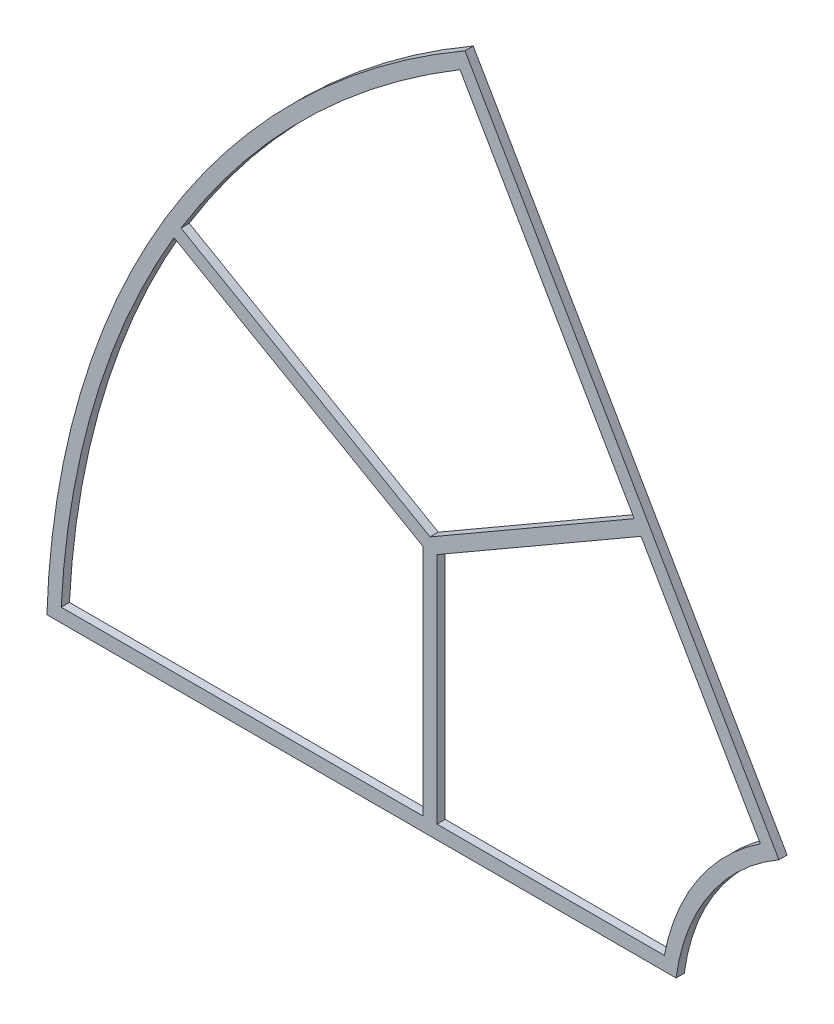
ISO-10303-21;
HEADER;
FILE_DESCRIPTION(('STEP AP214'),'2;1');
FILE_NAME('part.step','',(''),(''),'','','');
FILE_SCHEMA(('AUTOMOTIVE_DESIGN { 1 0 10303 214 1 1 1 1 }'));
ENDSEC;
DATA;
#1=APPLICATION_CONTEXT('core data for automotive mechanical design processes');
#2=APPLICATION_PROTOCOL_DEFINITION('international standard','automotive_design',2000,#1);
#3=PRODUCT_CONTEXT('',#1,'mechanical');
#4=PRODUCT('Part','Part','',(#3));
#5=PRODUCT_RELATED_PRODUCT_CATEGORY('part','',(#4));
#6=PRODUCT_DEFINITION_FORMATION('','',#4);
#7=PRODUCT_DEFINITION_CONTEXT('part definition',#1,'design');
#8=PRODUCT_DEFINITION('design','',#6,#7);
#9=PRODUCT_DEFINITION_SHAPE('','',#8);
#10=(LENGTH_UNIT() NAMED_UNIT(*) SI_UNIT(.MILLI.,.METRE.));
#11=(NAMED_UNIT(*) PLANE_ANGLE_UNIT() SI_UNIT($,.RADIAN.));
#12=(NAMED_UNIT(*) SI_UNIT($,.STERADIAN.) SOLID_ANGLE_UNIT());
#13=UNCERTAINTY_MEASURE_WITH_UNIT(LENGTH_MEASURE(1.E-05),#10,'distance_accuracy_value','');
#14=(GEOMETRIC_REPRESENTATION_CONTEXT(3) GLOBAL_UNCERTAINTY_ASSIGNED_CONTEXT((#13)) GLOBAL_UNIT_ASSIGNED_CONTEXT((#10,
#11,#12)) REPRESENTATION_CONTEXT('',''));
#15=CARTESIAN_POINT('',(0.,0.,0.));
#16=DIRECTION('',(0.,0.,1.));
#17=DIRECTION('',(1.,0.,0.));
#18=AXIS2_PLACEMENT_3D('',#15,#16,#17);
#19=CARTESIAN_POINT('',(0.,20.,6.));
#20=DIRECTION('',(0.,-1.,0.));
#21=DIRECTION('',(1.,0.,0.));
#22=AXIS2_PLACEMENT_3D('',#19,#20,#21);
#23=PLANE('',#22);
#24=DIRECTION('',(-1.,0.,0.));
#25=VECTOR('',#24,1.);
#26=CARTESIAN_POINT('',(0.,20.,0.));
#27=LINE('',#26,#25);
#28=CARTESIAN_POINT('',(-151.081964509335,20.,0.));
#29=VERTEX_POINT('',#28);
#30=CARTESIAN_POINT('',(-609.271827676268,20.,0.));
#31=VERTEX_POINT('',#30);
#32=EDGE_CURVE('E258',#29,#31,#27,.T.);
#33=ORIENTED_EDGE('',*,*,#32,.F.);
#34=DIRECTION('',(0.,0.,-1.));
#35=VECTOR('',#34,1.);
#36=CARTESIAN_POINT('',(-151.081964509335,20.,6.));
#37=LINE('',#36,#35);
#38=CARTESIAN_POINT('',(-151.081964509335,20.,6.));
#39=VERTEX_POINT('',#38);
#40=EDGE_CURVE('E11',#39,#29,#37,.T.);
#41=ORIENTED_EDGE('',*,*,#40,.F.);
#42=DIRECTION('',(-1.,0.,0.));
#43=VECTOR('',#42,1.);
#44=CARTESIAN_POINT('',(0.,20.,6.));
#45=LINE('',#44,#43);
#46=CARTESIAN_POINT('',(-609.271827676268,20.,6.));
#47=VERTEX_POINT('',#46);
#48=EDGE_CURVE('E197',#39,#47,#45,.T.);
#49=ORIENTED_EDGE('',*,*,#48,.T.);
#50=DIRECTION('',(0.,0.,-1.));
#51=VECTOR('',#50,1.);
#52=CARTESIAN_POINT('',(-609.271827676268,20.,6.));
#53=LINE('',#52,#51);
#54=EDGE_CURVE('E129',#47,#31,#53,.T.);
#55=ORIENTED_EDGE('',*,*,#54,.T.);
#56=EDGE_LOOP('',(#33,#41,#49,#55));
#57=FACE_BOUND('',#56,.T.);
#58=ADVANCED_FACE('F47',(#57),#23,.T.);
#59=CARTESIAN_POINT('',(0.,0.,6.));
#60=DIRECTION('',(0.,0.,-1.));
#61=DIRECTION('',(-1.,0.,0.));
#62=AXIS2_PLACEMENT_3D('',#59,#60,#61);
#63=CYLINDRICAL_SURFACE('',#62,152.4);
#64=CARTESIAN_POINT('',(0.,0.,0.));
#65=DIRECTION('',(0.,0.,1.));
#66=DIRECTION('',(1.,0.,0.));
#67=AXIS2_PLACEMENT_3D('',#64,#65,#66);
#68=CIRCLE('',#67,152.4);
#69=CARTESIAN_POINT('',(-76.1999999999998,131.982271536749,0.));
#70=VERTEX_POINT('',#69);
#71=EDGE_CURVE('E185',#70,#29,#68,.T.);
#72=ORIENTED_EDGE('',*,*,#71,.F.);
#73=DIRECTION('',(0.,0.,-1.));
#74=VECTOR('',#73,1.);
#75=CARTESIAN_POINT('',(-76.1999999999998,131.982271536749,6.));
#76=LINE('',#75,#74);
#77=CARTESIAN_POINT('',(-76.1999999999998,131.982271536749,6.));
#78=VERTEX_POINT('',#77);
#79=EDGE_CURVE('E58',#78,#70,#76,.T.);
#80=ORIENTED_EDGE('',*,*,#79,.F.);
#81=CARTESIAN_POINT('',(0.,0.,6.));
#82=DIRECTION('',(0.,0.,1.));
#83=DIRECTION('',(1.,0.,0.));
#84=AXIS2_PLACEMENT_3D('',#81,#82,#83);
#85=CIRCLE('',#84,152.4);
#86=EDGE_CURVE('E183',#78,#39,#85,.T.);
#87=ORIENTED_EDGE('',*,*,#86,.T.);
#88=ORIENTED_EDGE('',*,*,#40,.T.);
#89=EDGE_LOOP('',(#72,#80,#87,#88));
#90=FACE_BOUND('',#89,.T.);
#91=ADVANCED_FACE('F181',(#90),#63,.F.);
#92=CARTESIAN_POINT('',(0.,0.,6.));
#93=DIRECTION('',(-0.866025403784439,-0.499999999999999,0.));
#94=DIRECTION('',(0.499999999999999,-0.866025403784439,0.));
#95=AXIS2_PLACEMENT_3D('',#92,#93,#94);
#96=PLANE('',#95);
#97=DIRECTION('',(-0.499999999999999,0.866025403784439,0.));
#98=VECTOR('',#97,1.);
#99=CARTESIAN_POINT('',(0.,0.,0.));
#100=LINE('',#99,#98);
#101=CARTESIAN_POINT('',(-304.799999999991,527.92908614698,0.));
#102=VERTEX_POINT('',#101);
#103=EDGE_CURVE('E263',#70,#102,#100,.T.);
#104=ORIENTED_EDGE('',*,*,#103,.T.);
#105=DIRECTION('',(0.,0.,-1.));
#106=VECTOR('',#105,1.);
#107=CARTESIAN_POINT('',(-304.799999999991,527.92908614698,6.));
#108=LINE('',#107,#106);
#109=CARTESIAN_POINT('',(-304.799999999991,527.92908614698,6.));
#110=VERTEX_POINT('',#109);
#111=EDGE_CURVE('E189',#110,#102,#108,.T.);
#112=ORIENTED_EDGE('',*,*,#111,.F.);
#113=DIRECTION('',(-0.499999999999999,0.866025403784439,0.));
#114=VECTOR('',#113,1.);
#115=CARTESIAN_POINT('',(0.,0.,6.));
#116=LINE('',#115,#114);
#117=EDGE_CURVE('E192',#78,#110,#116,.T.);
#118=ORIENTED_EDGE('',*,*,#117,.F.);
#119=ORIENTED_EDGE('',*,*,#79,.T.);
#120=EDGE_LOOP('',(#104,#112,#118,#119));
#121=FACE_BOUND('',#120,.T.);
#122=ADVANCED_FACE('F193',(#121),#96,.F.);
#123=CARTESIAN_POINT('',(0.,0.,6.));
#124=DIRECTION('',(0.,0.,-1.));
#125=DIRECTION('',(-1.,0.,0.));
#126=AXIS2_PLACEMENT_3D('',#123,#124,#125);
#127=CYLINDRICAL_SURFACE('',#126,599.599999999983);
#128=CARTESIAN_POINT('',(0.,0.,0.));
#129=DIRECTION('',(0.,0.,1.));
#130=DIRECTION('',(1.,0.,0.));
#131=AXIS2_PLACEMENT_3D('',#128,#129,#130);
#132=CIRCLE('',#131,599.599999999983);
#133=CARTESIAN_POINT('',(-308.418556675144,514.196610158411,0.));
#134=VERTEX_POINT('',#133);
#135=CARTESIAN_POINT('',(-511.591783696143,312.72033329251,0.));
#136=VERTEX_POINT('',#135);
#137=EDGE_CURVE('E242',#134,#136,#132,.T.);
#138=ORIENTED_EDGE('',*,*,#137,.F.);
#139=DIRECTION('',(0.,0.,-1.));
#140=VECTOR('',#139,1.);
#141=CARTESIAN_POINT('',(-308.418556675144,514.196610158411,6.));
#142=LINE('',#141,#140);
#143=CARTESIAN_POINT('',(-308.418556675144,514.196610158411,6.));
#144=VERTEX_POINT('',#143);
#145=EDGE_CURVE('E271',#144,#134,#142,.T.);
#146=ORIENTED_EDGE('',*,*,#145,.F.);
#147=CARTESIAN_POINT('',(0.,0.,6.));
#148=DIRECTION('',(0.,0.,1.));
#149=DIRECTION('',(1.,0.,0.));
#150=AXIS2_PLACEMENT_3D('',#147,#148,#149);
#151=CIRCLE('',#150,599.599999999983);
#152=CARTESIAN_POINT('',(-511.591783696143,312.72033329251,6.));
#153=VERTEX_POINT('',#152);
#154=EDGE_CURVE('E359',#144,#153,#151,.T.);
#155=ORIENTED_EDGE('',*,*,#154,.T.);
#156=DIRECTION('',(0.,0.,-1.));
#157=VECTOR('',#156,1.);
#158=CARTESIAN_POINT('',(-511.591783696143,312.72033329251,6.));
#159=LINE('',#158,#157);
#160=EDGE_CURVE('E274',#153,#136,#159,.T.);
#161=ORIENTED_EDGE('',*,*,#160,.T.);
#162=EDGE_LOOP('',(#138,#146,#155,#161));
#163=FACE_BOUND('',#162,.T.);
#164=ADVANCED_FACE('F382',(#163),#127,.F.);
#165=CARTESIAN_POINT('',(-8.66025403784415,-4.99999999999987,6.));
#166=DIRECTION('',(-0.866025403784438,-0.5,0.));
#167=DIRECTION('',(0.5,-0.866025403784439,0.));
#168=AXIS2_PLACEMENT_3D('',#165,#166,#167);
#169=PLANE('',#168);
#170=DIRECTION('',(-0.5,0.866025403784439,0.));
#171=VECTOR('',#170,1.);
#172=CARTESIAN_POINT('',(-8.66025403784415,-4.99999999999987,0.));
#173=LINE('',#172,#171);
#174=CARTESIAN_POINT('',(-181.552122678432,294.457500701023,0.));
#175=VERTEX_POINT('',#174);
#176=EDGE_CURVE('E246',#175,#134,#173,.T.);
#177=ORIENTED_EDGE('',*,*,#176,.F.);
#178=DIRECTION('',(0.,0.,-1.));
#179=VECTOR('',#178,1.);
#180=CARTESIAN_POINT('',(-181.552122678432,294.457500701023,6.));
#181=LINE('',#180,#179);
#182=CARTESIAN_POINT('',(-181.552122678432,294.457500701023,6.));
#183=VERTEX_POINT('',#182);
#184=EDGE_CURVE('E281',#183,#175,#181,.T.);
#185=ORIENTED_EDGE('',*,*,#184,.F.);
#186=DIRECTION('',(-0.5,0.866025403784439,0.));
#187=VECTOR('',#186,1.);
#188=CARTESIAN_POINT('',(-8.66025403784415,-4.99999999999987,6.));
#189=LINE('',#188,#187);
#190=EDGE_CURVE('E363',#183,#144,#189,.T.);
#191=ORIENTED_EDGE('',*,*,#190,.T.);
#192=ORIENTED_EDGE('',*,*,#145,.T.);
#193=EDGE_LOOP('',(#177,#185,#191,#192));
#194=FACE_BOUND('',#193,.T.);
#195=ADVANCED_FACE('F385',(#194),#169,.T.);
#196=CARTESIAN_POINT('',(-172.891868640588,299.457500701023,6.));
#197=DIRECTION('',(-0.5,0.866025403784438,0.));
#198=DIRECTION('',(-0.866025403784439,-0.5,0.));
#199=AXIS2_PLACEMENT_3D('',#196,#197,#198);
#200=PLANE('',#199);
#201=DIRECTION('',(0.866025403784438,0.5,0.));
#202=VECTOR('',#201,1.);
#203=CARTESIAN_POINT('',(-172.891868640588,299.457500701023,0.));
#204=LINE('',#203,#202);
#205=CARTESIAN_POINT('',(-330.207563046549,208.631242187989,0.));
#206=VERTEX_POINT('',#205);
#207=EDGE_CURVE('E250',#206,#175,#204,.T.);
#208=ORIENTED_EDGE('',*,*,#207,.F.);
#209=DIRECTION('',(0.,0.,-1.));
#210=VECTOR('',#209,1.);
#211=CARTESIAN_POINT('',(-330.207563046549,208.631242187989,6.));
#212=LINE('',#211,#210);
#213=CARTESIAN_POINT('',(-330.207563046549,208.631242187989,6.));
#214=VERTEX_POINT('',#213);
#215=EDGE_CURVE('E277',#214,#206,#212,.T.);
#216=ORIENTED_EDGE('',*,*,#215,.F.);
#217=DIRECTION('',(0.866025403784438,0.5,0.));
#218=VECTOR('',#217,1.);
#219=CARTESIAN_POINT('',(-172.891868640588,299.457500701023,6.));
#220=LINE('',#219,#218);
#221=EDGE_CURVE('E367',#214,#183,#220,.T.);
#222=ORIENTED_EDGE('',*,*,#221,.T.);
#223=ORIENTED_EDGE('',*,*,#184,.T.);
#224=EDGE_LOOP('',(#208,#216,#222,#223));
#225=FACE_BOUND('',#224,.T.);
#226=ADVANCED_FACE('F388',(#225),#200,.T.);
#227=CARTESIAN_POINT('',(0.,0.,6.));
#228=DIRECTION('',(0.,0.,-1.));
#229=DIRECTION('',(-1.,0.,0.));
#230=AXIS2_PLACEMENT_3D('',#227,#228,#229);
#231=CYLINDRICAL_SURFACE('',#230,599.599999999983);
#232=CARTESIAN_POINT('',(0.,0.,0.));
#233=DIRECTION('',(0.,0.,1.));
#234=DIRECTION('',(1.,0.,0.));
#235=AXIS2_PLACEMENT_3D('',#232,#233,#234);
#236=CIRCLE('',#235,599.599999999983);
#237=CARTESIAN_POINT('',(-516.736885170736,304.143307511484,0.));
#238=VERTEX_POINT('',#237);
#239=CARTESIAN_POINT('',(-598.84902938886,30.,0.));
#240=VERTEX_POINT('',#239);
#241=EDGE_CURVE('E226',#238,#240,#236,.T.);
#242=ORIENTED_EDGE('',*,*,#241,.F.);
#243=DIRECTION('',(0.,0.,-1.));
#244=VECTOR('',#243,1.);
#245=CARTESIAN_POINT('',(-516.736885170736,304.143307511484,6.));
#246=LINE('',#245,#244);
#247=CARTESIAN_POINT('',(-516.736885170736,304.143307511484,6.));
#248=VERTEX_POINT('',#247);
#249=EDGE_CURVE('E278',#248,#238,#246,.T.);
#250=ORIENTED_EDGE('',*,*,#249,.F.);
#251=CARTESIAN_POINT('',(0.,0.,6.));
#252=DIRECTION('',(0.,0.,1.));
#253=DIRECTION('',(1.,0.,0.));
#254=AXIS2_PLACEMENT_3D('',#251,#252,#253);
#255=CIRCLE('',#254,599.599999999983);
#256=CARTESIAN_POINT('',(-598.84902938886,30.,6.));
#257=VERTEX_POINT('',#256);
#258=EDGE_CURVE('E340',#248,#257,#255,.T.);
#259=ORIENTED_EDGE('',*,*,#258,.T.);
#260=DIRECTION('',(0.,0.,-1.));
#261=VECTOR('',#260,1.);
#262=CARTESIAN_POINT('',(-598.84902938886,30.,6.));
#263=LINE('',#262,#261);
#264=EDGE_CURVE('E286',#257,#240,#263,.T.);
#265=ORIENTED_EDGE('',*,*,#264,.T.);
#266=EDGE_LOOP('',(#242,#250,#259,#265));
#267=FACE_BOUND('',#266,.T.);
#268=ADVANCED_FACE('F405',(#267),#231,.F.);
#269=CARTESIAN_POINT('',(3.28470566569906,5.72388298249105,6.));
#270=DIRECTION('',(-0.497727654062655,-0.867333374419136,0.));
#271=DIRECTION('',(0.867333374419137,-0.497727654062655,0.));
#272=AXIS2_PLACEMENT_3D('',#269,#270,#271);
#273=PLANE('',#272);
#274=DIRECTION('',(-0.867333374419137,0.497727654062655,0.));
#275=VECTOR('',#274,1.);
#276=CARTESIAN_POINT('',(3.28470566569906,5.72388298249105,0.));
#277=LINE('',#276,#275);
#278=CARTESIAN_POINT('',(-335.2,199.966608393473,0.));
#279=VERTEX_POINT('',#278);
#280=EDGE_CURVE('E230',#279,#238,#277,.T.);
#281=ORIENTED_EDGE('',*,*,#280,.F.);
#282=DIRECTION('',(0.,0.,-1.));
#283=VECTOR('',#282,1.);
#284=CARTESIAN_POINT('',(-335.2,199.966608393473,6.));
#285=LINE('',#284,#283);
#286=CARTESIAN_POINT('',(-335.2,199.966608393473,6.));
#287=VERTEX_POINT('',#286);
#288=EDGE_CURVE('E292',#287,#279,#285,.T.);
#289=ORIENTED_EDGE('',*,*,#288,.F.);
#290=DIRECTION('',(-0.867333374419137,0.497727654062655,0.));
#291=VECTOR('',#290,1.);
#292=CARTESIAN_POINT('',(3.28470566569906,5.72388298249105,6.));
#293=LINE('',#292,#291);
#294=EDGE_CURVE('E348',#287,#248,#293,.T.);
#295=ORIENTED_EDGE('',*,*,#294,.T.);
#296=ORIENTED_EDGE('',*,*,#249,.T.);
#297=EDGE_LOOP('',(#281,#289,#295,#296));
#298=FACE_BOUND('',#297,.T.);
#299=ADVANCED_FACE('F416',(#298),#273,.T.);
#300=CARTESIAN_POINT('',(-335.2,1.09476432274518E-13,6.));
#301=DIRECTION('',(-1.,0.,0.));
#302=DIRECTION('',(0.,-1.,0.));
#303=AXIS2_PLACEMENT_3D('',#300,#301,#302);
#304=PLANE('',#303);
#305=DIRECTION('',(0.,1.,0.));
#306=VECTOR('',#305,1.);
#307=CARTESIAN_POINT('',(-335.2,1.09476432274518E-13,0.));
#308=LINE('',#307,#306);
#309=CARTESIAN_POINT('',(-335.2,30.,0.));
#310=VERTEX_POINT('',#309);
#311=EDGE_CURVE('E234',#310,#279,#308,.T.);
#312=ORIENTED_EDGE('',*,*,#311,.F.);
#313=DIRECTION('',(0.,0.,-1.));
#314=VECTOR('',#313,1.);
#315=CARTESIAN_POINT('',(-335.2,30.,6.));
#316=LINE('',#315,#314);
#317=CARTESIAN_POINT('',(-335.2,30.,6.));
#318=VERTEX_POINT('',#317);
#319=EDGE_CURVE('E289',#318,#310,#316,.T.);
#320=ORIENTED_EDGE('',*,*,#319,.F.);
#321=DIRECTION('',(0.,1.,0.));
#322=VECTOR('',#321,1.);
#323=CARTESIAN_POINT('',(-335.2,1.09476432274518E-13,6.));
#324=LINE('',#323,#322);
#325=EDGE_CURVE('E352',#318,#287,#324,.T.);
#326=ORIENTED_EDGE('',*,*,#325,.T.);
#327=ORIENTED_EDGE('',*,*,#288,.T.);
#328=EDGE_LOOP('',(#312,#320,#326,#327));
#329=FACE_BOUND('',#328,.T.);
#330=ADVANCED_FACE('F413',(#329),#304,.T.);
#331=CARTESIAN_POINT('',(0.,0.,6.));
#332=DIRECTION('',(0.,0.,-1.));
#333=DIRECTION('',(-1.,0.,0.));
#334=AXIS2_PLACEMENT_3D('',#331,#332,#333);
#335=CYLINDRICAL_SURFACE('',#334,162.4);
#336=CARTESIAN_POINT('',(0.,0.,0.));
#337=DIRECTION('',(0.,0.,1.));
#338=DIRECTION('',(1.,0.,0.));
#339=AXIS2_PLACEMENT_3D('',#336,#337,#338);
#340=CIRCLE('',#339,162.4);
#341=CARTESIAN_POINT('',(-89.7061669514514,135.37563891217,0.));
#342=VERTEX_POINT('',#341);
#343=CARTESIAN_POINT('',(-159.605012452617,30.,0.));
#344=VERTEX_POINT('',#343);
#345=EDGE_CURVE('E208',#342,#344,#340,.T.);
#346=ORIENTED_EDGE('',*,*,#345,.T.);
#347=DIRECTION('',(0.,0.,-1.));
#348=VECTOR('',#347,1.);
#349=CARTESIAN_POINT('',(-159.605012452617,30.,6.));
#350=LINE('',#349,#348);
#351=CARTESIAN_POINT('',(-159.605012452617,30.,6.));
#352=VERTEX_POINT('',#351);
#353=EDGE_CURVE('E51',#352,#344,#350,.T.);
#354=ORIENTED_EDGE('',*,*,#353,.F.);
#355=CARTESIAN_POINT('',(0.,0.,6.));
#356=DIRECTION('',(0.,0.,1.));
#357=DIRECTION('',(1.,0.,0.));
#358=AXIS2_PLACEMENT_3D('',#355,#356,#357);
#359=CIRCLE('',#358,162.4);
#360=CARTESIAN_POINT('',(-89.7061669514514,135.37563891217,6.));
#361=VERTEX_POINT('',#360);
#362=EDGE_CURVE('E268',#361,#352,#359,.T.);
#363=ORIENTED_EDGE('',*,*,#362,.F.);
#364=DIRECTION('',(0.,0.,-1.));
#365=VECTOR('',#364,1.);
#366=CARTESIAN_POINT('',(-89.7061669514514,135.37563891217,6.));
#367=LINE('',#366,#365);
#368=EDGE_CURVE('E207',#361,#342,#367,.T.);
#369=ORIENTED_EDGE('',*,*,#368,.T.);
#370=EDGE_LOOP('',(#346,#354,#363,#369));
#371=FACE_BOUND('',#370,.T.);
#372=ADVANCED_FACE('F49',(#371),#335,.T.);
#373=CARTESIAN_POINT('',(0.,30.,6.));
#374=DIRECTION('',(0.,-1.,0.));
#375=DIRECTION('',(0.,0.,-1.));
#376=AXIS2_PLACEMENT_3D('',#373,#374,#375);
#377=PLANE('',#376);
#378=DIRECTION('',(-1.,0.,0.));
#379=VECTOR('',#378,1.);
#380=CARTESIAN_POINT('',(0.,30.,0.));
#381=LINE('',#380,#379);
#382=CARTESIAN_POINT('',(-325.2,30.,0.));
#383=VERTEX_POINT('',#382);
#384=EDGE_CURVE('E212',#344,#383,#381,.T.);
#385=ORIENTED_EDGE('',*,*,#384,.T.);
#386=DIRECTION('',(0.,0.,-1.));
#387=VECTOR('',#386,1.);
#388=CARTESIAN_POINT('',(-325.2,30.,6.));
#389=LINE('',#388,#387);
#390=CARTESIAN_POINT('',(-325.2,30.,6.));
#391=VERTEX_POINT('',#390);
#392=EDGE_CURVE('E305',#391,#383,#389,.T.);
#393=ORIENTED_EDGE('',*,*,#392,.F.);
#394=DIRECTION('',(-1.,0.,0.));
#395=VECTOR('',#394,1.);
#396=CARTESIAN_POINT('',(0.,30.,6.));
#397=LINE('',#396,#395);
#398=EDGE_CURVE('E137',#352,#391,#397,.T.);
#399=ORIENTED_EDGE('',*,*,#398,.F.);
#400=ORIENTED_EDGE('',*,*,#353,.T.);
#401=EDGE_LOOP('',(#385,#393,#399,#400));
#402=FACE_BOUND('',#401,.T.);
#403=ADVANCED_FACE('F313',(#402),#377,.F.);
#404=CARTESIAN_POINT('',(-325.2,0.,6.));
#405=DIRECTION('',(-1.,0.,0.));
#406=DIRECTION('',(0.,0.,1.));
#407=AXIS2_PLACEMENT_3D('',#404,#405,#406);
#408=PLANE('',#407);
#409=DIRECTION('',(0.,1.,0.));
#410=VECTOR('',#409,1.);
#411=CARTESIAN_POINT('',(-325.2,0.,0.));
#412=LINE('',#411,#410);
#413=CARTESIAN_POINT('',(-325.2,199.975354677105,0.));
#414=VERTEX_POINT('',#413);
#415=EDGE_CURVE('E215',#383,#414,#412,.T.);
#416=ORIENTED_EDGE('',*,*,#415,.T.);
#417=DIRECTION('',(0.,0.,-1.));
#418=VECTOR('',#417,1.);
#419=CARTESIAN_POINT('',(-325.2,199.975354677105,6.));
#420=LINE('',#419,#418);
#421=CARTESIAN_POINT('',(-325.2,199.975354677105,6.));
#422=VERTEX_POINT('',#421);
#423=EDGE_CURVE('E302',#422,#414,#420,.T.);
#424=ORIENTED_EDGE('',*,*,#423,.F.);
#425=DIRECTION('',(0.,1.,0.));
#426=VECTOR('',#425,1.);
#427=CARTESIAN_POINT('',(-325.2,0.,6.));
#428=LINE('',#427,#426);
#429=EDGE_CURVE('E333',#391,#422,#428,.T.);
#430=ORIENTED_EDGE('',*,*,#429,.F.);
#431=ORIENTED_EDGE('',*,*,#392,.T.);
#432=EDGE_LOOP('',(#416,#424,#430,#431));
#433=FACE_BOUND('',#432,.T.);
#434=ADVANCED_FACE('F332',(#433),#408,.F.);
#435=CARTESIAN_POINT('',(-167.891868640588,290.797246663179,6.));
#436=DIRECTION('',(-0.5,0.866025403784438,0.));
#437=DIRECTION('',(-0.866025403784439,-0.5,0.));
#438=AXIS2_PLACEMENT_3D('',#435,#436,#437);
#439=PLANE('',#438);
#440=DIRECTION('',(0.866025403784439,0.5,0.));
#441=VECTOR('',#440,1.);
#442=CARTESIAN_POINT('',(-167.891868640588,290.797246663179,0.));
#443=LINE('',#442,#441);
#444=CARTESIAN_POINT('',(-176.552122678432,285.797246663179,0.));
#445=VERTEX_POINT('',#444);
#446=EDGE_CURVE('E218',#414,#445,#443,.T.);
#447=ORIENTED_EDGE('',*,*,#446,.T.);
#448=DIRECTION('',(0.,0.,-1.));
#449=VECTOR('',#448,1.);
#450=CARTESIAN_POINT('',(-176.552122678432,285.797246663179,6.));
#451=LINE('',#450,#449);
#452=CARTESIAN_POINT('',(-176.552122678432,285.797246663179,6.));
#453=VERTEX_POINT('',#452);
#454=EDGE_CURVE('E299',#453,#445,#451,.T.);
#455=ORIENTED_EDGE('',*,*,#454,.F.);
#456=DIRECTION('',(0.866025403784439,0.5,0.));
#457=VECTOR('',#456,1.);
#458=CARTESIAN_POINT('',(-167.891868640588,290.797246663179,6.));
#459=LINE('',#458,#457);
#460=EDGE_CURVE('E334',#422,#453,#459,.T.);
#461=ORIENTED_EDGE('',*,*,#460,.F.);
#462=ORIENTED_EDGE('',*,*,#423,.T.);
#463=EDGE_LOOP('',(#447,#455,#461,#462));
#464=FACE_BOUND('',#463,.T.);
#465=ADVANCED_FACE('F330',(#464),#439,.F.);
#466=CARTESIAN_POINT('',(8.26198220632558,14.3972167266824,6.));
#467=DIRECTION('',(-0.497727654062655,-0.867333374419136,0.));
#468=DIRECTION('',(0.867333374419137,-0.497727654062655,0.));
#469=AXIS2_PLACEMENT_3D('',#466,#467,#468);
#470=PLANE('',#469);
#471=DIRECTION('',(-0.867333374419136,0.497727654062655,0.));
#472=VECTOR('',#471,1.);
#473=CARTESIAN_POINT('',(8.26198220632558,14.3972167266824,0.));
#474=LINE('',#473,#472);
#475=EDGE_CURVE('E254',#206,#136,#474,.T.);
#476=ORIENTED_EDGE('',*,*,#475,.T.);
#477=ORIENTED_EDGE('',*,*,#160,.F.);
#478=DIRECTION('',(-0.867333374419136,0.497727654062655,0.));
#479=VECTOR('',#478,1.);
#480=CARTESIAN_POINT('',(8.26198220632558,14.3972167266824,6.));
#481=LINE('',#480,#479);
#482=EDGE_CURVE('E201',#214,#153,#481,.T.);
#483=ORIENTED_EDGE('',*,*,#482,.F.);
#484=ORIENTED_EDGE('',*,*,#215,.T.);
#485=EDGE_LOOP('',(#476,#477,#483,#484));
#486=FACE_BOUND('',#485,.T.);
#487=ADVANCED_FACE('F378',(#486),#470,.F.);
#488=CARTESIAN_POINT('',(0.,30.,6.));
#489=DIRECTION('',(0.,-1.,0.));
#490=DIRECTION('',(0.,0.,-1.));
#491=AXIS2_PLACEMENT_3D('',#488,#489,#490);
#492=PLANE('',#491);
#493=DIRECTION('',(-1.,0.,0.));
#494=VECTOR('',#493,1.);
#495=CARTESIAN_POINT('',(0.,30.,0.));
#496=LINE('',#495,#494);
#497=EDGE_CURVE('E238',#310,#240,#496,.T.);
#498=ORIENTED_EDGE('',*,*,#497,.T.);
#499=ORIENTED_EDGE('',*,*,#264,.F.);
#500=DIRECTION('',(-1.,0.,0.));
#501=VECTOR('',#500,1.);
#502=CARTESIAN_POINT('',(0.,30.,6.));
#503=LINE('',#502,#501);
#504=EDGE_CURVE('E356',#318,#257,#503,.T.);
#505=ORIENTED_EDGE('',*,*,#504,.F.);
#506=ORIENTED_EDGE('',*,*,#319,.T.);
#507=EDGE_LOOP('',(#498,#499,#505,#506));
#508=FACE_BOUND('',#507,.T.);
#509=ADVANCED_FACE('F402',(#508),#492,.F.);
#510=CARTESIAN_POINT('',(-8.6602540378442,-4.99999999999989,6.));
#511=DIRECTION('',(-0.866025403784439,-0.5,0.));
#512=DIRECTION('',(0.5,-0.866025403784439,0.));
#513=AXIS2_PLACEMENT_3D('',#510,#511,#512);
#514=PLANE('',#513);
#515=DIRECTION('',(-0.5,0.866025403784439,0.));
#516=VECTOR('',#515,1.);
#517=CARTESIAN_POINT('',(-8.6602540378442,-4.99999999999989,0.));
#518=LINE('',#517,#516);
#519=EDGE_CURVE('E222',#342,#445,#518,.T.);
#520=ORIENTED_EDGE('',*,*,#519,.F.);
#521=ORIENTED_EDGE('',*,*,#368,.F.);
#522=DIRECTION('',(-0.5,0.866025403784439,0.));
#523=VECTOR('',#522,1.);
#524=CARTESIAN_POINT('',(-8.6602540378442,-4.99999999999989,6.));
#525=LINE('',#524,#523);
#526=EDGE_CURVE('E327',#361,#453,#525,.T.);
#527=ORIENTED_EDGE('',*,*,#526,.T.);
#528=ORIENTED_EDGE('',*,*,#454,.T.);
#529=EDGE_LOOP('',(#520,#521,#527,#528));
#530=FACE_BOUND('',#529,.T.);
#531=ADVANCED_FACE('F323',(#530),#514,.T.);
#532=CARTESIAN_POINT('',(0.,0.,6.));
#533=DIRECTION('',(0.,0.,-1.));
#534=DIRECTION('',(-1.,0.,0.));
#535=AXIS2_PLACEMENT_3D('',#532,#533,#534);
#536=CYLINDRICAL_SURFACE('',#535,609.599999999983);
#537=CARTESIAN_POINT('',(0.,0.,0.));
#538=DIRECTION('',(0.,0.,1.));
#539=DIRECTION('',(1.,0.,0.));
#540=AXIS2_PLACEMENT_3D('',#537,#538,#539);
#541=CIRCLE('',#540,609.599999999983);
#542=EDGE_CURVE('E122',#102,#31,#541,.T.);
#543=ORIENTED_EDGE('',*,*,#542,.T.);
#544=ORIENTED_EDGE('',*,*,#54,.F.);
#545=CARTESIAN_POINT('',(0.,0.,6.));
#546=DIRECTION('',(0.,0.,1.));
#547=DIRECTION('',(1.,0.,0.));
#548=AXIS2_PLACEMENT_3D('',#545,#546,#547);
#549=CIRCLE('',#548,609.599999999983);
#550=EDGE_CURVE('E67',#110,#47,#549,.T.);
#551=ORIENTED_EDGE('',*,*,#550,.F.);
#552=ORIENTED_EDGE('',*,*,#111,.T.);
#553=EDGE_LOOP('',(#543,#544,#551,#552));
#554=FACE_BOUND('',#553,.T.);
#555=ADVANCED_FACE('F426',(#554),#536,.T.);
#556=CARTESIAN_POINT('',(0.,0.,6.));
#557=DIRECTION('',(0.,0.,1.));
#558=DIRECTION('',(1.,0.,0.));
#559=AXIS2_PLACEMENT_3D('',#556,#557,#558);
#560=PLANE('',#559);
#561=ORIENTED_EDGE('',*,*,#362,.T.);
#562=ORIENTED_EDGE('',*,*,#398,.T.);
#563=ORIENTED_EDGE('',*,*,#429,.T.);
#564=ORIENTED_EDGE('',*,*,#460,.T.);
#565=ORIENTED_EDGE('',*,*,#526,.F.);
#566=EDGE_LOOP('',(#561,#562,#563,#564,#565));
#567=FACE_BOUND('',#566,.T.);
#568=ORIENTED_EDGE('',*,*,#258,.F.);
#569=ORIENTED_EDGE('',*,*,#294,.F.);
#570=ORIENTED_EDGE('',*,*,#325,.F.);
#571=ORIENTED_EDGE('',*,*,#504,.T.);
#572=EDGE_LOOP('',(#568,#569,#570,#571));
#573=FACE_BOUND('',#572,.T.);
#574=ORIENTED_EDGE('',*,*,#154,.F.);
#575=ORIENTED_EDGE('',*,*,#190,.F.);
#576=ORIENTED_EDGE('',*,*,#221,.F.);
#577=ORIENTED_EDGE('',*,*,#482,.T.);
#578=EDGE_LOOP('',(#574,#575,#576,#577));
#579=FACE_BOUND('',#578,.T.);
#580=ORIENTED_EDGE('',*,*,#48,.F.);
#581=ORIENTED_EDGE('',*,*,#86,.F.);
#582=ORIENTED_EDGE('',*,*,#117,.T.);
#583=ORIENTED_EDGE('',*,*,#550,.T.);
#584=EDGE_LOOP('',(#580,#581,#582,#583));
#585=FACE_BOUND('',#584,.T.);
#586=ADVANCED_FACE('F196',(#567,#573,#579,#585),#560,.T.);
#587=CARTESIAN_POINT('',(0.,0.,0.));
#588=DIRECTION('',(0.,0.,1.));
#589=DIRECTION('',(1.,0.,0.));
#590=AXIS2_PLACEMENT_3D('',#587,#588,#589);
#591=PLANE('',#590);
#592=ORIENTED_EDGE('',*,*,#345,.F.);
#593=ORIENTED_EDGE('',*,*,#519,.T.);
#594=ORIENTED_EDGE('',*,*,#446,.F.);
#595=ORIENTED_EDGE('',*,*,#415,.F.);
#596=ORIENTED_EDGE('',*,*,#384,.F.);
#597=EDGE_LOOP('',(#592,#593,#594,#595,#596));
#598=FACE_BOUND('',#597,.T.);
#599=ORIENTED_EDGE('',*,*,#241,.T.);
#600=ORIENTED_EDGE('',*,*,#497,.F.);
#601=ORIENTED_EDGE('',*,*,#311,.T.);
#602=ORIENTED_EDGE('',*,*,#280,.T.);
#603=EDGE_LOOP('',(#599,#600,#601,#602));
#604=FACE_BOUND('',#603,.T.);
#605=ORIENTED_EDGE('',*,*,#137,.T.);
#606=ORIENTED_EDGE('',*,*,#475,.F.);
#607=ORIENTED_EDGE('',*,*,#207,.T.);
#608=ORIENTED_EDGE('',*,*,#176,.T.);
#609=EDGE_LOOP('',(#605,#606,#607,#608));
#610=FACE_BOUND('',#609,.T.);
#611=ORIENTED_EDGE('',*,*,#32,.T.);
#612=ORIENTED_EDGE('',*,*,#542,.F.);
#613=ORIENTED_EDGE('',*,*,#103,.F.);
#614=ORIENTED_EDGE('',*,*,#71,.T.);
#615=EDGE_LOOP('',(#611,#612,#613,#614));
#616=FACE_BOUND('',#615,.T.);
#617=ADVANCED_FACE('F319',(#598,#604,#610,#616),#591,.F.);
#618=CLOSED_SHELL('',(#58,#91,#122,#164,#195,#226,#268,#299,#330,#372,#403,#434,#465,#487,#509,
#531,#555,#586,#617));
#619=MANIFOLD_SOLID_BREP('B2',#618);
#620=ADVANCED_BREP_SHAPE_REPRESENTATION('',(#18,#619),#14);
#621=SHAPE_DEFINITION_REPRESENTATION(#9,#620);
ENDSEC;
END-ISO-10303-21;
